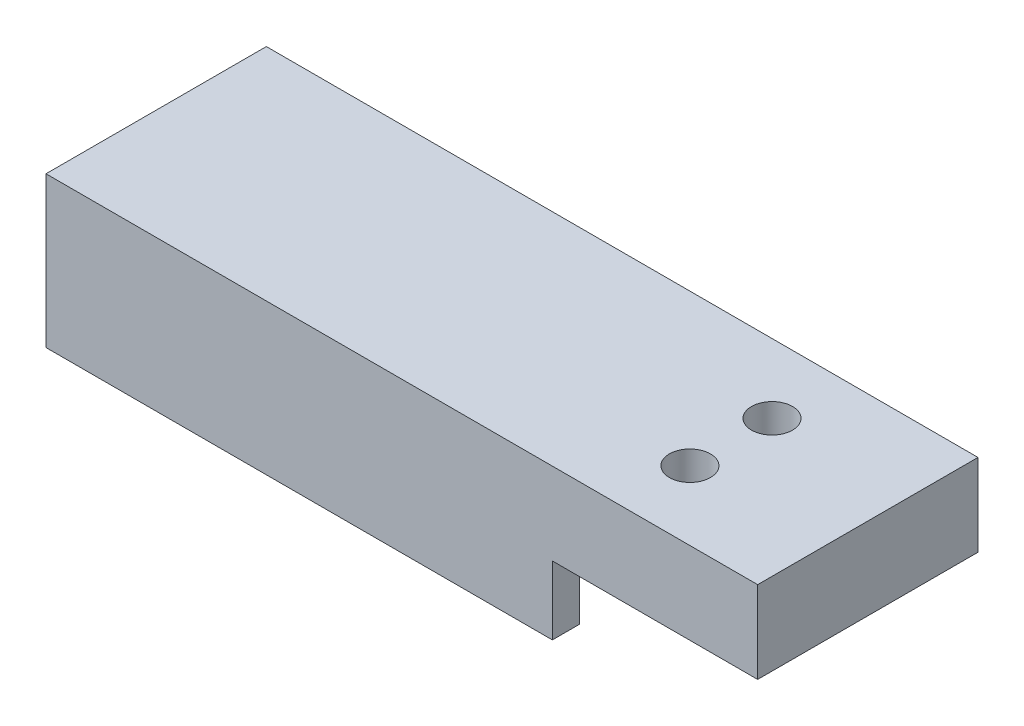
ISO-10303-21;
HEADER;
FILE_DESCRIPTION(('STEP AP214'),'2;1');
FILE_NAME('part.step','',(''),(''),'','','');
FILE_SCHEMA(('AUTOMOTIVE_DESIGN { 1 0 10303 214 1 1 1 1 }'));
ENDSEC;
DATA;
#1=APPLICATION_CONTEXT('core data for automotive mechanical design processes');
#2=APPLICATION_PROTOCOL_DEFINITION('international standard','automotive_design',2000,#1);
#3=PRODUCT_CONTEXT('',#1,'mechanical');
#4=PRODUCT('Part','Part','',(#3));
#5=PRODUCT_RELATED_PRODUCT_CATEGORY('part','',(#4));
#6=PRODUCT_DEFINITION_FORMATION('','',#4);
#7=PRODUCT_DEFINITION_CONTEXT('part definition',#1,'design');
#8=PRODUCT_DEFINITION('design','',#6,#7);
#9=PRODUCT_DEFINITION_SHAPE('','',#8);
#10=(LENGTH_UNIT() NAMED_UNIT(*) SI_UNIT(.MILLI.,.METRE.));
#11=(NAMED_UNIT(*) PLANE_ANGLE_UNIT() SI_UNIT($,.RADIAN.));
#12=(NAMED_UNIT(*) SI_UNIT($,.STERADIAN.) SOLID_ANGLE_UNIT());
#13=UNCERTAINTY_MEASURE_WITH_UNIT(LENGTH_MEASURE(1.E-05),#10,'distance_accuracy_value','');
#14=(GEOMETRIC_REPRESENTATION_CONTEXT(3) GLOBAL_UNCERTAINTY_ASSIGNED_CONTEXT((#13)) GLOBAL_UNIT_ASSIGNED_CONTEXT((#10,
#11,#12)) REPRESENTATION_CONTEXT('',''));
#15=CARTESIAN_POINT('',(0.,0.,0.));
#16=DIRECTION('',(0.,0.,1.));
#17=DIRECTION('',(1.,0.,0.));
#18=AXIS2_PLACEMENT_3D('',#15,#16,#17);
#19=CARTESIAN_POINT('',(-25.,5.,-2.6));
#20=DIRECTION('',(-1.,0.,0.));
#21=DIRECTION('',(0.,0.,1.));
#22=AXIS2_PLACEMENT_3D('',#19,#20,#21);
#23=PLANE('',#22);
#24=DIRECTION('',(0.,0.,-1.));
#25=VECTOR('',#24,1.);
#26=CARTESIAN_POINT('',(-25.,0.,-2.6));
#27=LINE('',#26,#25);
#28=CARTESIAN_POINT('',(-25.,0.,2.6));
#29=VERTEX_POINT('',#28);
#30=CARTESIAN_POINT('',(-25.,0.,-2.6));
#31=VERTEX_POINT('',#30);
#32=EDGE_CURVE('E185',#29,#31,#27,.T.);
#33=ORIENTED_EDGE('',*,*,#32,.T.);
#34=DIRECTION('',(0.,-1.,0.));
#35=VECTOR('',#34,1.);
#36=CARTESIAN_POINT('',(-25.,5.,-2.6));
#37=LINE('',#36,#35);
#38=CARTESIAN_POINT('',(-25.,5.,-2.6));
#39=VERTEX_POINT('',#38);
#40=EDGE_CURVE('E11',#39,#31,#37,.T.);
#41=ORIENTED_EDGE('',*,*,#40,.F.);
#42=DIRECTION('',(0.,0.,-1.));
#43=VECTOR('',#42,1.);
#44=CARTESIAN_POINT('',(-25.,5.,-2.6));
#45=LINE('',#44,#43);
#46=CARTESIAN_POINT('',(-25.,5.,2.6));
#47=VERTEX_POINT('',#46);
#48=EDGE_CURVE('E157',#47,#39,#45,.T.);
#49=ORIENTED_EDGE('',*,*,#48,.F.);
#50=DIRECTION('',(0.,-1.,0.));
#51=VECTOR('',#50,1.);
#52=CARTESIAN_POINT('',(-25.,5.,2.6));
#53=LINE('',#52,#51);
#54=EDGE_CURVE('E158',#47,#29,#53,.T.);
#55=ORIENTED_EDGE('',*,*,#54,.T.);
#56=EDGE_LOOP('',(#33,#41,#49,#55));
#57=FACE_BOUND('',#56,.T.);
#58=ADVANCED_FACE('F33',(#57),#23,.F.);
#59=CARTESIAN_POINT('',(-25.,5.,-2.6));
#60=DIRECTION('',(-0.707106781186551,0.,-0.707106781186544));
#61=DIRECTION('',(-0.707106781186544,0.,0.707106781186551));
#62=AXIS2_PLACEMENT_3D('',#59,#60,#61);
#63=PLANE('',#62);
#64=DIRECTION('',(0.707106781186544,0.,-0.707106781186551));
#65=VECTOR('',#64,1.);
#66=CARTESIAN_POINT('',(-25.,0.,-2.6));
#67=LINE('',#66,#65);
#68=CARTESIAN_POINT('',(-21.55,0.,-6.05));
#69=VERTEX_POINT('',#68);
#70=EDGE_CURVE('E147',#31,#69,#67,.T.);
#71=ORIENTED_EDGE('',*,*,#70,.T.);
#72=DIRECTION('',(0.,-1.,0.));
#73=VECTOR('',#72,1.);
#74=CARTESIAN_POINT('',(-21.55,5.,-6.05));
#75=LINE('',#74,#73);
#76=CARTESIAN_POINT('',(-21.55,5.,-6.05));
#77=VERTEX_POINT('',#76);
#78=EDGE_CURVE('E40',#77,#69,#75,.T.);
#79=ORIENTED_EDGE('',*,*,#78,.F.);
#80=DIRECTION('',(0.707106781186544,0.,-0.707106781186551));
#81=VECTOR('',#80,1.);
#82=CARTESIAN_POINT('',(-25.,5.,-2.6));
#83=LINE('',#82,#81);
#84=EDGE_CURVE('E188',#39,#77,#83,.T.);
#85=ORIENTED_EDGE('',*,*,#84,.F.);
#86=ORIENTED_EDGE('',*,*,#40,.T.);
#87=EDGE_LOOP('',(#71,#79,#85,#86));
#88=FACE_BOUND('',#87,.T.);
#89=ADVANCED_FACE('F187',(#88),#63,.F.);
#90=CARTESIAN_POINT('',(-21.55,5.,-6.05));
#91=DIRECTION('',(0.,0.,-1.));
#92=DIRECTION('',(-1.,0.,0.));
#93=AXIS2_PLACEMENT_3D('',#90,#91,#92);
#94=PLANE('',#93);
#95=DIRECTION('',(1.,0.,0.));
#96=VECTOR('',#95,1.);
#97=CARTESIAN_POINT('',(-21.55,0.,-6.05));
#98=LINE('',#97,#96);
#99=CARTESIAN_POINT('',(9.99999999999999,0.,-6.05));
#100=VERTEX_POINT('',#99);
#101=EDGE_CURVE('E143',#69,#100,#98,.T.);
#102=ORIENTED_EDGE('',*,*,#101,.T.);
#103=DIRECTION('',(0.,1.,0.));
#104=VECTOR('',#103,1.);
#105=CARTESIAN_POINT('',(9.99999999999999,5.,-6.05));
#106=LINE('',#105,#104);
#107=CARTESIAN_POINT('',(10.,5.,-6.05));
#108=VERTEX_POINT('',#107);
#109=EDGE_CURVE('E47',#100,#108,#106,.T.);
#110=ORIENTED_EDGE('',*,*,#109,.T.);
#111=DIRECTION('',(1.,0.,0.));
#112=VECTOR('',#111,1.);
#113=CARTESIAN_POINT('',(-21.55,5.,-6.05));
#114=LINE('',#113,#112);
#115=EDGE_CURVE('E179',#77,#108,#114,.T.);
#116=ORIENTED_EDGE('',*,*,#115,.F.);
#117=ORIENTED_EDGE('',*,*,#78,.T.);
#118=EDGE_LOOP('',(#102,#110,#116,#117));
#119=FACE_BOUND('',#118,.T.);
#120=ADVANCED_FACE('F177',(#119),#94,.F.);
#121=CARTESIAN_POINT('',(-27.,5.,-8.05));
#122=DIRECTION('',(0.,0.,1.));
#123=DIRECTION('',(1.,0.,0.));
#124=AXIS2_PLACEMENT_3D('',#121,#122,#123);
#125=PLANE('',#124);
#126=DIRECTION('',(0.,-1.,0.));
#127=VECTOR('',#126,1.);
#128=CARTESIAN_POINT('',(25.,5.,-8.05));
#129=LINE('',#128,#127);
#130=CARTESIAN_POINT('',(25.,11.,-8.05));
#131=VERTEX_POINT('',#130);
#132=CARTESIAN_POINT('',(25.,5.,-8.05));
#133=VERTEX_POINT('',#132);
#134=EDGE_CURVE('E173',#131,#133,#129,.T.);
#135=ORIENTED_EDGE('',*,*,#134,.T.);
#136=DIRECTION('',(1.,0.,0.));
#137=VECTOR('',#136,1.);
#138=CARTESIAN_POINT('',(25.,5.,-8.05));
#139=LINE('',#138,#137);
#140=CARTESIAN_POINT('',(10.,5.,-8.05));
#141=VERTEX_POINT('',#140);
#142=EDGE_CURVE('E137',#141,#133,#139,.T.);
#143=ORIENTED_EDGE('',*,*,#142,.F.);
#144=DIRECTION('',(0.,1.,0.));
#145=VECTOR('',#144,1.);
#146=CARTESIAN_POINT('',(10.,5.,-8.05));
#147=LINE('',#146,#145);
#148=CARTESIAN_POINT('',(10.,0.,-8.05));
#149=VERTEX_POINT('',#148);
#150=EDGE_CURVE('E122',#149,#141,#147,.T.);
#151=ORIENTED_EDGE('',*,*,#150,.F.);
#152=DIRECTION('',(-1.,0.,0.));
#153=VECTOR('',#152,1.);
#154=CARTESIAN_POINT('',(-27.,0.,-8.05));
#155=LINE('',#154,#153);
#156=CARTESIAN_POINT('',(-27.,0.,-8.05));
#157=VERTEX_POINT('',#156);
#158=EDGE_CURVE('E134',#149,#157,#155,.T.);
#159=ORIENTED_EDGE('',*,*,#158,.T.);
#160=DIRECTION('',(0.,-1.,0.));
#161=VECTOR('',#160,1.);
#162=CARTESIAN_POINT('',(-27.,5.,-8.05));
#163=LINE('',#162,#161);
#164=CARTESIAN_POINT('',(-27.,11.,-8.05));
#165=VERTEX_POINT('',#164);
#166=EDGE_CURVE('E171',#165,#157,#163,.T.);
#167=ORIENTED_EDGE('',*,*,#166,.F.);
#168=DIRECTION('',(-1.,0.,0.));
#169=VECTOR('',#168,1.);
#170=CARTESIAN_POINT('',(25.,11.,-8.05));
#171=LINE('',#170,#169);
#172=EDGE_CURVE('E211',#131,#165,#171,.T.);
#173=ORIENTED_EDGE('',*,*,#172,.F.);
#174=EDGE_LOOP('',(#135,#143,#151,#159,#167,#173));
#175=FACE_BOUND('',#174,.T.);
#176=ADVANCED_FACE('F133',(#175),#125,.F.);
#177=CARTESIAN_POINT('',(-27.,5.,-8.05));
#178=DIRECTION('',(1.,0.,0.));
#179=DIRECTION('',(0.,0.,-1.));
#180=AXIS2_PLACEMENT_3D('',#177,#178,#179);
#181=PLANE('',#180);
#182=DIRECTION('',(0.,0.,1.));
#183=VECTOR('',#182,1.);
#184=CARTESIAN_POINT('',(-27.,0.,-8.05));
#185=LINE('',#184,#183);
#186=CARTESIAN_POINT('',(-27.,0.,8.05));
#187=VERTEX_POINT('',#186);
#188=EDGE_CURVE('E142',#157,#187,#185,.T.);
#189=ORIENTED_EDGE('',*,*,#188,.T.);
#190=DIRECTION('',(0.,-1.,0.));
#191=VECTOR('',#190,1.);
#192=CARTESIAN_POINT('',(-27.,5.,8.05));
#193=LINE('',#192,#191);
#194=CARTESIAN_POINT('',(-27.,11.,8.05));
#195=VERTEX_POINT('',#194);
#196=EDGE_CURVE('E168',#195,#187,#193,.T.);
#197=ORIENTED_EDGE('',*,*,#196,.F.);
#198=DIRECTION('',(0.,0.,1.));
#199=VECTOR('',#198,1.);
#200=CARTESIAN_POINT('',(-27.,11.,-8.05));
#201=LINE('',#200,#199);
#202=EDGE_CURVE('E195',#165,#195,#201,.T.);
#203=ORIENTED_EDGE('',*,*,#202,.F.);
#204=ORIENTED_EDGE('',*,*,#166,.T.);
#205=EDGE_LOOP('',(#189,#197,#203,#204));
#206=FACE_BOUND('',#205,.T.);
#207=ADVANCED_FACE('F259',(#206),#181,.F.);
#208=CARTESIAN_POINT('',(-27.,5.,8.05));
#209=DIRECTION('',(0.,0.,-1.));
#210=DIRECTION('',(-1.,0.,0.));
#211=AXIS2_PLACEMENT_3D('',#208,#209,#210);
#212=PLANE('',#211);
#213=DIRECTION('',(0.,1.,0.));
#214=VECTOR('',#213,1.);
#215=CARTESIAN_POINT('',(10.,5.,8.05));
#216=LINE('',#215,#214);
#217=CARTESIAN_POINT('',(10.,0.,8.05));
#218=VERTEX_POINT('',#217);
#219=CARTESIAN_POINT('',(10.,5.,8.05));
#220=VERTEX_POINT('',#219);
#221=EDGE_CURVE('E55',#218,#220,#216,.T.);
#222=ORIENTED_EDGE('',*,*,#221,.T.);
#223=DIRECTION('',(1.,0.,0.));
#224=VECTOR('',#223,1.);
#225=CARTESIAN_POINT('',(25.,5.,8.05));
#226=LINE('',#225,#224);
#227=CARTESIAN_POINT('',(25.,5.,8.05));
#228=VERTEX_POINT('',#227);
#229=EDGE_CURVE('E129',#220,#228,#226,.T.);
#230=ORIENTED_EDGE('',*,*,#229,.T.);
#231=DIRECTION('',(0.,-1.,0.));
#232=VECTOR('',#231,1.);
#233=CARTESIAN_POINT('',(25.,5.,8.05));
#234=LINE('',#233,#232);
#235=CARTESIAN_POINT('',(25.,11.,8.05));
#236=VERTEX_POINT('',#235);
#237=EDGE_CURVE('E165',#236,#228,#234,.T.);
#238=ORIENTED_EDGE('',*,*,#237,.F.);
#239=DIRECTION('',(1.,0.,0.));
#240=VECTOR('',#239,1.);
#241=CARTESIAN_POINT('',(-27.,11.,8.05));
#242=LINE('',#241,#240);
#243=EDGE_CURVE('E192',#195,#236,#242,.T.);
#244=ORIENTED_EDGE('',*,*,#243,.F.);
#245=ORIENTED_EDGE('',*,*,#196,.T.);
#246=DIRECTION('',(1.,0.,0.));
#247=VECTOR('',#246,1.);
#248=CARTESIAN_POINT('',(-27.,0.,8.05));
#249=LINE('',#248,#247);
#250=EDGE_CURVE('E145',#187,#218,#249,.T.);
#251=ORIENTED_EDGE('',*,*,#250,.T.);
#252=EDGE_LOOP('',(#222,#230,#238,#244,#245,#251));
#253=FACE_BOUND('',#252,.T.);
#254=ADVANCED_FACE('F248',(#253),#212,.F.);
#255=CARTESIAN_POINT('',(25.,5.,6.05));
#256=DIRECTION('',(-1.,0.,0.));
#257=DIRECTION('',(0.,0.,1.));
#258=AXIS2_PLACEMENT_3D('',#255,#256,#257);
#259=PLANE('',#258);
#260=ORIENTED_EDGE('',*,*,#237,.T.);
#261=DIRECTION('',(0.,0.,-1.));
#262=VECTOR('',#261,1.);
#263=CARTESIAN_POINT('',(25.,5.,-6.05));
#264=LINE('',#263,#262);
#265=EDGE_CURVE('E205',#228,#133,#264,.T.);
#266=ORIENTED_EDGE('',*,*,#265,.T.);
#267=ORIENTED_EDGE('',*,*,#134,.F.);
#268=DIRECTION('',(0.,0.,-1.));
#269=VECTOR('',#268,1.);
#270=CARTESIAN_POINT('',(25.,11.,-6.05));
#271=LINE('',#270,#269);
#272=EDGE_CURVE('E206',#236,#131,#271,.T.);
#273=ORIENTED_EDGE('',*,*,#272,.F.);
#274=EDGE_LOOP('',(#260,#266,#267,#273));
#275=FACE_BOUND('',#274,.T.);
#276=ADVANCED_FACE('F245',(#275),#259,.F.);
#277=CARTESIAN_POINT('',(-21.55,5.,6.05));
#278=DIRECTION('',(0.,0.,1.));
#279=DIRECTION('',(1.,0.,0.));
#280=AXIS2_PLACEMENT_3D('',#277,#278,#279);
#281=PLANE('',#280);
#282=DIRECTION('',(-1.,0.,0.));
#283=VECTOR('',#282,1.);
#284=CARTESIAN_POINT('',(-21.55,5.,6.05));
#285=LINE('',#284,#283);
#286=CARTESIAN_POINT('',(10.,5.,6.05));
#287=VERTEX_POINT('',#286);
#288=CARTESIAN_POINT('',(-21.55,5.,6.05));
#289=VERTEX_POINT('',#288);
#290=EDGE_CURVE('E200',#287,#289,#285,.T.);
#291=ORIENTED_EDGE('',*,*,#290,.F.);
#292=DIRECTION('',(0.,-1.,0.));
#293=VECTOR('',#292,1.);
#294=CARTESIAN_POINT('',(9.99999999999999,5.,6.05));
#295=LINE('',#294,#293);
#296=CARTESIAN_POINT('',(10.,0.,6.05));
#297=VERTEX_POINT('',#296);
#298=EDGE_CURVE('E228',#287,#297,#295,.T.);
#299=ORIENTED_EDGE('',*,*,#298,.T.);
#300=DIRECTION('',(-1.,0.,0.));
#301=VECTOR('',#300,1.);
#302=CARTESIAN_POINT('',(-21.55,0.,6.05));
#303=LINE('',#302,#301);
#304=CARTESIAN_POINT('',(-21.55,0.,6.05));
#305=VERTEX_POINT('',#304);
#306=EDGE_CURVE('E153',#297,#305,#303,.T.);
#307=ORIENTED_EDGE('',*,*,#306,.T.);
#308=DIRECTION('',(0.,-1.,0.));
#309=VECTOR('',#308,1.);
#310=CARTESIAN_POINT('',(-21.55,5.,6.05));
#311=LINE('',#310,#309);
#312=EDGE_CURVE('E161',#289,#305,#311,.T.);
#313=ORIENTED_EDGE('',*,*,#312,.F.);
#314=EDGE_LOOP('',(#291,#299,#307,#313));
#315=FACE_BOUND('',#314,.T.);
#316=ADVANCED_FACE('F252',(#315),#281,.F.);
#317=CARTESIAN_POINT('',(-25.,5.,2.6));
#318=DIRECTION('',(-0.707106781186546,0.,0.707106781186549));
#319=DIRECTION('',(0.707106781186549,0.,0.707106781186546));
#320=AXIS2_PLACEMENT_3D('',#317,#318,#319);
#321=PLANE('',#320);
#322=DIRECTION('',(-0.707106781186549,0.,-0.707106781186546));
#323=VECTOR('',#322,1.);
#324=CARTESIAN_POINT('',(-25.,0.,2.6));
#325=LINE('',#324,#323);
#326=EDGE_CURVE('E155',#305,#29,#325,.T.);
#327=ORIENTED_EDGE('',*,*,#326,.T.);
#328=ORIENTED_EDGE('',*,*,#54,.F.);
#329=DIRECTION('',(-0.707106781186549,0.,-0.707106781186546));
#330=VECTOR('',#329,1.);
#331=CARTESIAN_POINT('',(-25.,5.,2.6));
#332=LINE('',#331,#330);
#333=EDGE_CURVE('E162',#289,#47,#332,.T.);
#334=ORIENTED_EDGE('',*,*,#333,.F.);
#335=ORIENTED_EDGE('',*,*,#312,.T.);
#336=EDGE_LOOP('',(#327,#328,#334,#335));
#337=FACE_BOUND('',#336,.T.);
#338=ADVANCED_FACE('F256',(#337),#321,.F.);
#339=CARTESIAN_POINT('',(0.,0.,0.));
#340=DIRECTION('',(0.,1.,0.));
#341=DIRECTION('',(0.,0.,1.));
#342=AXIS2_PLACEMENT_3D('',#339,#340,#341);
#343=PLANE('',#342);
#344=ORIENTED_EDGE('',*,*,#158,.F.);
#345=DIRECTION('',(0.,0.,-1.));
#346=VECTOR('',#345,1.);
#347=CARTESIAN_POINT('',(10.,0.,8.05));
#348=LINE('',#347,#346);
#349=EDGE_CURVE('E119',#100,#149,#348,.T.);
#350=ORIENTED_EDGE('',*,*,#349,.F.);
#351=ORIENTED_EDGE('',*,*,#101,.F.);
#352=ORIENTED_EDGE('',*,*,#70,.F.);
#353=ORIENTED_EDGE('',*,*,#32,.F.);
#354=ORIENTED_EDGE('',*,*,#326,.F.);
#355=ORIENTED_EDGE('',*,*,#306,.F.);
#356=EDGE_CURVE('E128',#218,#297,#348,.T.);
#357=ORIENTED_EDGE('',*,*,#356,.F.);
#358=ORIENTED_EDGE('',*,*,#250,.F.);
#359=ORIENTED_EDGE('',*,*,#188,.F.);
#360=EDGE_LOOP('',(#344,#350,#351,#352,#353,#354,#355,#357,#358,#359));
#361=FACE_BOUND('',#360,.T.);
#362=ADVANCED_FACE('F140',(#361),#343,.F.);
#363=CARTESIAN_POINT('',(0.,5.,0.));
#364=DIRECTION('',(0.,1.,0.));
#365=DIRECTION('',(0.,0.,1.));
#366=AXIS2_PLACEMENT_3D('',#363,#364,#365);
#367=PLANE('',#366);
#368=ORIENTED_EDGE('',*,*,#115,.T.);
#369=DIRECTION('',(0.,0.,-1.));
#370=VECTOR('',#369,1.);
#371=CARTESIAN_POINT('',(10.,5.,8.05));
#372=LINE('',#371,#370);
#373=EDGE_CURVE('E232',#108,#141,#372,.T.);
#374=ORIENTED_EDGE('',*,*,#373,.T.);
#375=ORIENTED_EDGE('',*,*,#142,.T.);
#376=ORIENTED_EDGE('',*,*,#265,.F.);
#377=ORIENTED_EDGE('',*,*,#229,.F.);
#378=EDGE_CURVE('E230',#220,#287,#372,.T.);
#379=ORIENTED_EDGE('',*,*,#378,.T.);
#380=ORIENTED_EDGE('',*,*,#290,.T.);
#381=ORIENTED_EDGE('',*,*,#333,.T.);
#382=ORIENTED_EDGE('',*,*,#48,.T.);
#383=ORIENTED_EDGE('',*,*,#84,.T.);
#384=EDGE_LOOP('',(#368,#374,#375,#376,#377,#379,#380,#381,#382,#383));
#385=FACE_BOUND('',#384,.T.);
#386=CARTESIAN_POINT('',(15.,5.,-3.));
#387=DIRECTION('',(0.,-1.,0.));
#388=DIRECTION('',(0.,0.,-1.));
#389=AXIS2_PLACEMENT_3D('',#386,#387,#388);
#390=CIRCLE('',#389,1.5);
#391=CARTESIAN_POINT('',(15.,5.,-4.5));
#392=VERTEX_POINT('',#391);
#393=EDGE_CURVE('E216',#392,#392,#390,.T.);
#394=ORIENTED_EDGE('',*,*,#393,.F.);
#395=EDGE_LOOP('',(#394));
#396=FACE_BOUND('',#395,.T.);
#397=CARTESIAN_POINT('',(15.,5.,3.));
#398=DIRECTION('',(0.,-1.,0.));
#399=DIRECTION('',(0.,0.,-1.));
#400=AXIS2_PLACEMENT_3D('',#397,#398,#399);
#401=CIRCLE('',#400,1.5);
#402=CARTESIAN_POINT('',(15.,5.,1.5));
#403=VERTEX_POINT('',#402);
#404=EDGE_CURVE('E222',#403,#403,#401,.T.);
#405=ORIENTED_EDGE('',*,*,#404,.F.);
#406=EDGE_LOOP('',(#405));
#407=FACE_BOUND('',#406,.T.);
#408=ADVANCED_FACE('F239',(#385,#396,#407),#367,.F.);
#409=CARTESIAN_POINT('',(0.,11.,0.));
#410=DIRECTION('',(0.,1.,0.));
#411=DIRECTION('',(0.,0.,1.));
#412=AXIS2_PLACEMENT_3D('',#409,#410,#411);
#413=PLANE('',#412);
#414=CARTESIAN_POINT('',(15.,11.,3.));
#415=DIRECTION('',(0.,-1.,0.));
#416=DIRECTION('',(0.,0.,-1.));
#417=AXIS2_PLACEMENT_3D('',#414,#415,#416);
#418=CIRCLE('',#417,1.5);
#419=CARTESIAN_POINT('',(15.,11.,1.5));
#420=VERTEX_POINT('',#419);
#421=EDGE_CURVE('E207',#420,#420,#418,.T.);
#422=ORIENTED_EDGE('',*,*,#421,.T.);
#423=EDGE_LOOP('',(#422));
#424=FACE_BOUND('',#423,.T.);
#425=CARTESIAN_POINT('',(15.,11.,-3.));
#426=DIRECTION('',(0.,-1.,0.));
#427=DIRECTION('',(0.,0.,-1.));
#428=AXIS2_PLACEMENT_3D('',#425,#426,#427);
#429=CIRCLE('',#428,1.5);
#430=CARTESIAN_POINT('',(15.,11.,-4.5));
#431=VERTEX_POINT('',#430);
#432=EDGE_CURVE('E219',#431,#431,#429,.T.);
#433=ORIENTED_EDGE('',*,*,#432,.T.);
#434=EDGE_LOOP('',(#433));
#435=FACE_BOUND('',#434,.T.);
#436=ORIENTED_EDGE('',*,*,#272,.T.);
#437=ORIENTED_EDGE('',*,*,#172,.T.);
#438=ORIENTED_EDGE('',*,*,#202,.T.);
#439=ORIENTED_EDGE('',*,*,#243,.T.);
#440=EDGE_LOOP('',(#436,#437,#438,#439));
#441=FACE_BOUND('',#440,.T.);
#442=ADVANCED_FACE('F261',(#424,#435,#441),#413,.T.);
#443=CARTESIAN_POINT('',(15.,11.,-3.));
#444=DIRECTION('',(0.,-1.,0.));
#445=DIRECTION('',(0.,0.,-1.));
#446=AXIS2_PLACEMENT_3D('',#443,#444,#445);
#447=CYLINDRICAL_SURFACE('',#446,1.5);
#448=ORIENTED_EDGE('',*,*,#432,.F.);
#449=EDGE_LOOP('',(#448));
#450=FACE_BOUND('',#449,.T.);
#451=ORIENTED_EDGE('',*,*,#393,.T.);
#452=EDGE_LOOP('',(#451));
#453=FACE_BOUND('',#452,.T.);
#454=ADVANCED_FACE('F263',(#450,#453),#447,.F.);
#455=CARTESIAN_POINT('',(15.,11.,3.));
#456=DIRECTION('',(0.,-1.,0.));
#457=DIRECTION('',(0.,0.,-1.));
#458=AXIS2_PLACEMENT_3D('',#455,#456,#457);
#459=CYLINDRICAL_SURFACE('',#458,1.5);
#460=ORIENTED_EDGE('',*,*,#421,.F.);
#461=EDGE_LOOP('',(#460));
#462=FACE_BOUND('',#461,.T.);
#463=ORIENTED_EDGE('',*,*,#404,.T.);
#464=EDGE_LOOP('',(#463));
#465=FACE_BOUND('',#464,.T.);
#466=ADVANCED_FACE('F270',(#462,#465),#459,.F.);
#467=CARTESIAN_POINT('',(10.,5.,8.05));
#468=DIRECTION('',(-1.,0.,0.));
#469=DIRECTION('',(0.,0.,1.));
#470=AXIS2_PLACEMENT_3D('',#467,#468,#469);
#471=PLANE('',#470);
#472=ORIENTED_EDGE('',*,*,#378,.F.);
#473=ORIENTED_EDGE('',*,*,#221,.F.);
#474=ORIENTED_EDGE('',*,*,#356,.T.);
#475=ORIENTED_EDGE('',*,*,#298,.F.);
#476=EDGE_LOOP('',(#472,#473,#474,#475));
#477=FACE_BOUND('',#476,.T.);
#478=ADVANCED_FACE('F314',(#477),#471,.F.);
#479=ORIENTED_EDGE('',*,*,#349,.T.);
#480=ORIENTED_EDGE('',*,*,#150,.T.);
#481=ORIENTED_EDGE('',*,*,#373,.F.);
#482=ORIENTED_EDGE('',*,*,#109,.F.);
#483=EDGE_LOOP('',(#479,#480,#481,#482));
#484=FACE_BOUND('',#483,.T.);
#485=ADVANCED_FACE('F121',(#484),#471,.F.);
#486=CLOSED_SHELL('',(#58,#89,#120,#176,#207,#254,#276,#316,#338,#362,#408,#442,#454,#466,#478,#485));
#487=MANIFOLD_SOLID_BREP('B2',#486);
#488=ADVANCED_BREP_SHAPE_REPRESENTATION('',(#18,#487),#14);
#489=SHAPE_DEFINITION_REPRESENTATION(#9,#488);
ENDSEC;
END-ISO-10303-21;
